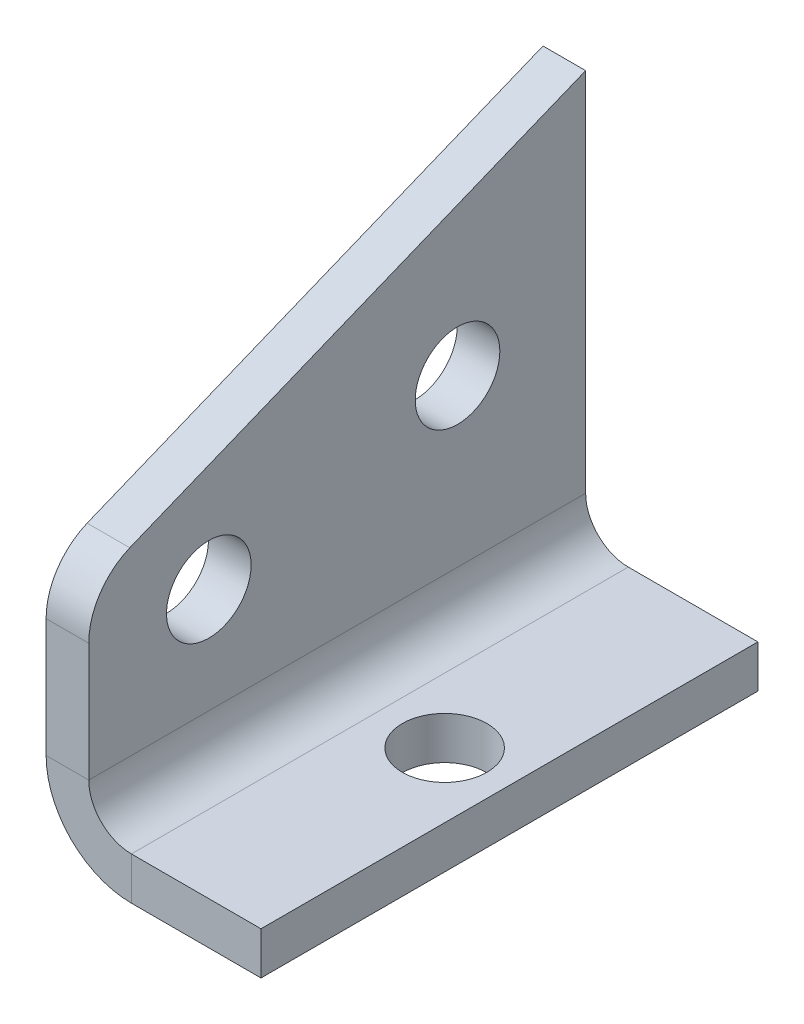
ISO-10303-21;
HEADER;
FILE_DESCRIPTION(('STEP AP214'),'2;1');
FILE_NAME('part.step','',(''),(''),'','','');
FILE_SCHEMA(('AUTOMOTIVE_DESIGN { 1 0 10303 214 1 1 1 1 }'));
ENDSEC;
DATA;
#1=APPLICATION_CONTEXT('core data for automotive mechanical design processes');
#2=APPLICATION_PROTOCOL_DEFINITION('international standard','automotive_design',2000,#1);
#3=PRODUCT_CONTEXT('',#1,'mechanical');
#4=PRODUCT('Part','Part','',(#3));
#5=PRODUCT_RELATED_PRODUCT_CATEGORY('part','',(#4));
#6=PRODUCT_DEFINITION_FORMATION('','',#4);
#7=PRODUCT_DEFINITION_CONTEXT('part definition',#1,'design');
#8=PRODUCT_DEFINITION('design','',#6,#7);
#9=PRODUCT_DEFINITION_SHAPE('','',#8);
#10=(LENGTH_UNIT() NAMED_UNIT(*) SI_UNIT(.MILLI.,.METRE.));
#11=(NAMED_UNIT(*) PLANE_ANGLE_UNIT() SI_UNIT($,.RADIAN.));
#12=(NAMED_UNIT(*) SI_UNIT($,.STERADIAN.) SOLID_ANGLE_UNIT());
#13=UNCERTAINTY_MEASURE_WITH_UNIT(LENGTH_MEASURE(1.E-05),#10,'distance_accuracy_value','');
#14=(GEOMETRIC_REPRESENTATION_CONTEXT(3) GLOBAL_UNCERTAINTY_ASSIGNED_CONTEXT((#13)) GLOBAL_UNIT_ASSIGNED_CONTEXT((#10,
#11,#12)) REPRESENTATION_CONTEXT('',''));
#15=CARTESIAN_POINT('',(0.,0.,0.));
#16=DIRECTION('',(0.,0.,1.));
#17=DIRECTION('',(1.,0.,0.));
#18=AXIS2_PLACEMENT_3D('',#15,#16,#17);
#19=CARTESIAN_POINT('',(-3.175,40.2912185861881,-48.5510647852261));
#20=DIRECTION('',(0.,0.,-1.));
#21=DIRECTION('',(-1.,0.,0.));
#22=AXIS2_PLACEMENT_3D('',#19,#20,#21);
#23=PLANE('',#22);
#24=DIRECTION('',(0.,1.,0.));
#25=VECTOR('',#24,1.);
#26=CARTESIAN_POINT('',(0.,40.2912185861881,-48.5510647852261));
#27=LINE('',#26,#25);
#28=CARTESIAN_POINT('',(0.,44.8412185861881,-48.5510647852261));
#29=VERTEX_POINT('',#28);
#30=CARTESIAN_POINT('',(0.,72.0930667513475,-48.5510647852261));
#31=VERTEX_POINT('',#30);
#32=EDGE_CURVE('E229',#29,#31,#27,.T.);
#33=ORIENTED_EDGE('',*,*,#32,.F.);
#34=DIRECTION('',(-1.,0.,0.));
#35=VECTOR('',#34,1.);
#36=CARTESIAN_POINT('',(0.,44.8412185861881,-48.5510647852261));
#37=LINE('',#36,#35);
#38=CARTESIAN_POINT('',(-3.175,44.8412185861881,-48.5510647852261));
#39=VERTEX_POINT('',#38);
#40=EDGE_CURVE('E192',#29,#39,#37,.T.);
#41=ORIENTED_EDGE('',*,*,#40,.T.);
#42=DIRECTION('',(0.,1.,0.));
#43=VECTOR('',#42,1.);
#44=CARTESIAN_POINT('',(-3.175,40.2912185861881,-48.5510647852261));
#45=LINE('',#44,#43);
#46=CARTESIAN_POINT('',(-3.175,72.0930667513475,-48.5510647852261));
#47=VERTEX_POINT('',#46);
#48=EDGE_CURVE('E108',#39,#47,#45,.T.);
#49=ORIENTED_EDGE('',*,*,#48,.T.);
#50=DIRECTION('',(1.,0.,0.));
#51=VECTOR('',#50,1.);
#52=CARTESIAN_POINT('',(-3.175,72.0930667513475,-48.5510647852261));
#53=LINE('',#52,#51);
#54=EDGE_CURVE('E67',#47,#31,#53,.T.);
#55=ORIENTED_EDGE('',*,*,#54,.T.);
#56=EDGE_LOOP('',(#33,#41,#49,#55));
#57=FACE_BOUND('',#56,.T.);
#58=ADVANCED_FACE('F63',(#57),#23,.T.);
#59=CARTESIAN_POINT('',(-3.175,53.6927819865224,-16.5509889828002));
#60=DIRECTION('',(1.,0.,0.));
#61=DIRECTION('',(0.,0.,-1.));
#62=AXIS2_PLACEMENT_3D('',#59,#60,#61);
#63=PLANE('',#62);
#64=CARTESIAN_POINT('',(-3.175,57.1947735785803,-39.0112205884761));
#65=DIRECTION('',(1.,0.,0.));
#66=DIRECTION('',(0.,0.,-1.));
#67=AXIS2_PLACEMENT_3D('',#64,#65,#66);
#68=CIRCLE('',#67,3.15);
#69=CARTESIAN_POINT('',(-3.175,57.1947735785803,-42.1612205884761));
#70=VERTEX_POINT('',#69);
#71=EDGE_CURVE('E213',#70,#70,#68,.T.);
#72=ORIENTED_EDGE('',*,*,#71,.T.);
#73=EDGE_LOOP('',(#72));
#74=FACE_BOUND('',#73,.T.);
#75=CARTESIAN_POINT('',(-3.175,52.6725231012808,-20.4902032658352));
#76=DIRECTION('',(1.,0.,0.));
#77=DIRECTION('',(0.,0.,-1.));
#78=AXIS2_PLACEMENT_3D('',#75,#76,#77);
#79=CIRCLE('',#78,3.15);
#80=CARTESIAN_POINT('',(-3.175,52.6725231012808,-23.6402032658352));
#81=VERTEX_POINT('',#80);
#82=EDGE_CURVE('E207',#81,#81,#79,.T.);
#83=ORIENTED_EDGE('',*,*,#82,.T.);
#84=EDGE_LOOP('',(#83));
#85=FACE_BOUND('',#84,.T.);
#86=DIRECTION('',(0.,0.,-1.));
#87=VECTOR('',#86,1.);
#88=CARTESIAN_POINT('',(-3.175,44.8412185861881,-48.5510647852261));
#89=LINE('',#88,#87);
#90=CARTESIAN_POINT('',(-3.175,44.8412185861881,-11.5510647852261));
#91=VERTEX_POINT('',#90);
#92=EDGE_CURVE('E186',#39,#91,#89,.F.);
#93=ORIENTED_EDGE('',*,*,#92,.T.);
#94=DIRECTION('',(0.,-1.,0.));
#95=VECTOR('',#94,1.);
#96=CARTESIAN_POINT('',(-3.175,53.6652498505171,-11.5510647852261));
#97=LINE('',#96,#95);
#98=CARTESIAN_POINT('',(-3.175,53.6652498505171,-11.5510647852261));
#99=VERTEX_POINT('',#98);
#100=EDGE_CURVE('E219',#99,#91,#97,.T.);
#101=ORIENTED_EDGE('',*,*,#100,.F.);
#102=CARTESIAN_POINT('',(-3.175,53.6927819865224,-16.5509889828002));
#103=DIRECTION('',(1.,0.,0.));
#104=DIRECTION('',(0.,0.,-1.));
#105=AXIS2_PLACEMENT_3D('',#102,#103,#104);
#106=CIRCLE('',#105,5.);
#107=CARTESIAN_POINT('',(-3.175,58.2975596939057,-14.6026506483251));
#108=VERTEX_POINT('',#107);
#109=EDGE_CURVE('E226',#108,#99,#106,.T.);
#110=ORIENTED_EDGE('',*,*,#109,.F.);
#111=DIRECTION('',(0.,-0.376469891536026,0.926428853591496));
#112=VECTOR('',#111,1.);
#113=CARTESIAN_POINT('',(-3.175,72.0930667513475,-48.5510647852261));
#114=LINE('',#113,#112);
#115=EDGE_CURVE('E223',#47,#108,#114,.T.);
#116=ORIENTED_EDGE('',*,*,#115,.F.);
#117=ORIENTED_EDGE('',*,*,#48,.F.);
#118=EDGE_LOOP('',(#93,#101,#110,#116,#117));
#119=FACE_BOUND('',#118,.T.);
#120=ADVANCED_FACE('F244',(#74,#85,#119),#63,.F.);
#121=CARTESIAN_POINT('',(0.,53.6927819865224,-16.5509889828002));
#122=DIRECTION('',(1.,0.,0.));
#123=DIRECTION('',(0.,0.,-1.));
#124=AXIS2_PLACEMENT_3D('',#121,#122,#123);
#125=PLANE('',#124);
#126=CARTESIAN_POINT('',(0.,52.6725231012808,-20.4902032658352));
#127=DIRECTION('',(1.,0.,0.));
#128=DIRECTION('',(0.,0.,-1.));
#129=AXIS2_PLACEMENT_3D('',#126,#127,#128);
#130=CIRCLE('',#129,3.15);
#131=CARTESIAN_POINT('',(0.,52.6725231012808,-23.6402032658352));
#132=VERTEX_POINT('',#131);
#133=EDGE_CURVE('E205',#132,#132,#130,.T.);
#134=ORIENTED_EDGE('',*,*,#133,.F.);
#135=EDGE_LOOP('',(#134));
#136=FACE_BOUND('',#135,.T.);
#137=CARTESIAN_POINT('',(0.,57.1947735785803,-39.0112205884761));
#138=DIRECTION('',(1.,0.,0.));
#139=DIRECTION('',(0.,0.,-1.));
#140=AXIS2_PLACEMENT_3D('',#137,#138,#139);
#141=CIRCLE('',#140,3.15);
#142=CARTESIAN_POINT('',(0.,57.1947735785803,-42.1612205884761));
#143=VERTEX_POINT('',#142);
#144=EDGE_CURVE('E210',#143,#143,#141,.T.);
#145=ORIENTED_EDGE('',*,*,#144,.F.);
#146=EDGE_LOOP('',(#145));
#147=FACE_BOUND('',#146,.T.);
#148=DIRECTION('',(0.,-1.,0.));
#149=VECTOR('',#148,1.);
#150=CARTESIAN_POINT('',(0.,53.6652498505171,-11.5510647852261));
#151=LINE('',#150,#149);
#152=CARTESIAN_POINT('',(0.,53.6652498505171,-11.5510647852261));
#153=VERTEX_POINT('',#152);
#154=CARTESIAN_POINT('',(0.,44.8412185861881,-11.5510647852261));
#155=VERTEX_POINT('',#154);
#156=EDGE_CURVE('E216',#153,#155,#151,.T.);
#157=ORIENTED_EDGE('',*,*,#156,.T.);
#158=DIRECTION('',(0.,0.,-1.));
#159=VECTOR('',#158,1.);
#160=CARTESIAN_POINT('',(0.,44.8412185861881,-48.5510647852261));
#161=LINE('',#160,#159);
#162=EDGE_CURVE('E80',#29,#155,#161,.F.);
#163=ORIENTED_EDGE('',*,*,#162,.F.);
#164=ORIENTED_EDGE('',*,*,#32,.T.);
#165=DIRECTION('',(0.,-0.376469891536026,0.926428853591496));
#166=VECTOR('',#165,1.);
#167=CARTESIAN_POINT('',(0.,72.0930667513475,-48.5510647852261));
#168=LINE('',#167,#166);
#169=CARTESIAN_POINT('',(0.,58.2975596939057,-14.6026506483251));
#170=VERTEX_POINT('',#169);
#171=EDGE_CURVE('E231',#31,#170,#168,.T.);
#172=ORIENTED_EDGE('',*,*,#171,.T.);
#173=CARTESIAN_POINT('',(0.,53.6927819865224,-16.5509889828002));
#174=DIRECTION('',(1.,0.,0.));
#175=DIRECTION('',(0.,0.,-1.));
#176=AXIS2_PLACEMENT_3D('',#173,#174,#175);
#177=CIRCLE('',#176,5.);
#178=EDGE_CURVE('E221',#170,#153,#177,.T.);
#179=ORIENTED_EDGE('',*,*,#178,.T.);
#180=EDGE_LOOP('',(#157,#163,#164,#172,#179));
#181=FACE_BOUND('',#180,.T.);
#182=ADVANCED_FACE('F240',(#136,#147,#181),#125,.T.);
#183=CARTESIAN_POINT('',(-3.175,53.6652498505171,-11.5510647852261));
#184=DIRECTION('',(0.,0.,1.));
#185=DIRECTION('',(0.,-1.,0.));
#186=AXIS2_PLACEMENT_3D('',#183,#184,#185);
#187=PLANE('',#186);
#188=DIRECTION('',(-1.,0.,0.));
#189=VECTOR('',#188,1.);
#190=CARTESIAN_POINT('',(0.,44.8412185861881,-11.5510647852261));
#191=LINE('',#190,#189);
#192=EDGE_CURVE('E202',#155,#91,#191,.T.);
#193=ORIENTED_EDGE('',*,*,#192,.F.);
#194=ORIENTED_EDGE('',*,*,#156,.F.);
#195=DIRECTION('',(1.,0.,0.));
#196=VECTOR('',#195,1.);
#197=CARTESIAN_POINT('',(-3.175,53.6652498505171,-11.5510647852261));
#198=LINE('',#197,#196);
#199=EDGE_CURVE('E13',#99,#153,#198,.T.);
#200=ORIENTED_EDGE('',*,*,#199,.F.);
#201=ORIENTED_EDGE('',*,*,#100,.T.);
#202=EDGE_LOOP('',(#193,#194,#200,#201));
#203=FACE_BOUND('',#202,.T.);
#204=ADVANCED_FACE('F65',(#203),#187,.T.);
#205=CARTESIAN_POINT('',(-3.175,53.6927819865224,-16.5509889828002));
#206=DIRECTION('',(1.,0.,0.));
#207=DIRECTION('',(0.,0.,-1.));
#208=AXIS2_PLACEMENT_3D('',#205,#206,#207);
#209=CYLINDRICAL_SURFACE('',#208,5.);
#210=ORIENTED_EDGE('',*,*,#178,.F.);
#211=DIRECTION('',(1.,0.,0.));
#212=VECTOR('',#211,1.);
#213=CARTESIAN_POINT('',(-3.175,58.2975596939057,-14.6026506483251));
#214=LINE('',#213,#212);
#215=EDGE_CURVE('E72',#108,#170,#214,.T.);
#216=ORIENTED_EDGE('',*,*,#215,.F.);
#217=ORIENTED_EDGE('',*,*,#109,.T.);
#218=ORIENTED_EDGE('',*,*,#199,.T.);
#219=EDGE_LOOP('',(#210,#216,#217,#218));
#220=FACE_BOUND('',#219,.T.);
#221=ADVANCED_FACE('F241',(#220),#209,.T.);
#222=CARTESIAN_POINT('',(-3.175,72.0930667513475,-48.5510647852261));
#223=DIRECTION('',(0.,0.926428853591496,0.376469891536026));
#224=DIRECTION('',(0.,-0.376469891536026,0.926428853591496));
#225=AXIS2_PLACEMENT_3D('',#222,#223,#224);
#226=PLANE('',#225);
#227=ORIENTED_EDGE('',*,*,#171,.F.);
#228=ORIENTED_EDGE('',*,*,#54,.F.);
#229=ORIENTED_EDGE('',*,*,#115,.T.);
#230=ORIENTED_EDGE('',*,*,#215,.T.);
#231=EDGE_LOOP('',(#227,#228,#229,#230));
#232=FACE_BOUND('',#231,.T.);
#233=ADVANCED_FACE('F239',(#232),#226,.T.);
#234=CARTESIAN_POINT('',(-3.175,57.1947735785803,-39.0112205884761));
#235=DIRECTION('',(1.,0.,0.));
#236=DIRECTION('',(0.,0.,-1.));
#237=AXIS2_PLACEMENT_3D('',#234,#235,#236);
#238=CYLINDRICAL_SURFACE('',#237,3.15);
#239=ORIENTED_EDGE('',*,*,#71,.F.);
#240=EDGE_LOOP('',(#239));
#241=FACE_BOUND('',#240,.T.);
#242=ORIENTED_EDGE('',*,*,#144,.T.);
#243=EDGE_LOOP('',(#242));
#244=FACE_BOUND('',#243,.T.);
#245=ADVANCED_FACE('F297',(#241,#244),#238,.F.);
#246=CARTESIAN_POINT('',(-3.175,52.6725231012808,-20.4902032658352));
#247=DIRECTION('',(1.,0.,0.));
#248=DIRECTION('',(0.,0.,-1.));
#249=AXIS2_PLACEMENT_3D('',#246,#247,#248);
#250=CYLINDRICAL_SURFACE('',#249,3.15);
#251=ORIENTED_EDGE('',*,*,#82,.F.);
#252=EDGE_LOOP('',(#251));
#253=FACE_BOUND('',#252,.T.);
#254=ORIENTED_EDGE('',*,*,#133,.T.);
#255=EDGE_LOOP('',(#254));
#256=FACE_BOUND('',#255,.T.);
#257=ADVANCED_FACE('F284',(#253,#256),#250,.F.);
#258=CARTESIAN_POINT('',(3.175,44.8412185861881,-11.5510647852261));
#259=DIRECTION('',(0.,0.,1.));
#260=DIRECTION('',(1.,0.,0.));
#261=AXIS2_PLACEMENT_3D('',#258,#259,#260);
#262=PLANE('',#261);
#263=DIRECTION('',(0.,1.,0.));
#264=VECTOR('',#263,1.);
#265=CARTESIAN_POINT('',(3.17499999999998,38.4912185861881,-11.5510647852261));
#266=LINE('',#265,#264);
#267=CARTESIAN_POINT('',(3.17499999999999,41.6662185861881,-11.5510647852261));
#268=VERTEX_POINT('',#267);
#269=CARTESIAN_POINT('',(3.17499999999998,38.4912185861881,-11.5510647852261));
#270=VERTEX_POINT('',#269);
#271=EDGE_CURVE('E168',#268,#270,#266,.F.);
#272=ORIENTED_EDGE('',*,*,#271,.F.);
#273=CARTESIAN_POINT('',(3.175,44.8412185861881,-11.5510647852261));
#274=DIRECTION('',(0.,0.,-1.));
#275=DIRECTION('',(-1.,0.,0.));
#276=AXIS2_PLACEMENT_3D('',#273,#274,#275);
#277=CIRCLE('',#276,3.175);
#278=EDGE_CURVE('E195',#155,#268,#277,.F.);
#279=ORIENTED_EDGE('',*,*,#278,.F.);
#280=ORIENTED_EDGE('',*,*,#192,.T.);
#281=CARTESIAN_POINT('',(3.175,44.8412185861881,-11.5510647852261));
#282=DIRECTION('',(0.,0.,-1.));
#283=DIRECTION('',(-1.,0.,0.));
#284=AXIS2_PLACEMENT_3D('',#281,#282,#283);
#285=CIRCLE('',#284,6.35);
#286=EDGE_CURVE('E188',#91,#270,#285,.F.);
#287=ORIENTED_EDGE('',*,*,#286,.T.);
#288=EDGE_LOOP('',(#272,#279,#280,#287));
#289=FACE_BOUND('',#288,.T.);
#290=ADVANCED_FACE('F249',(#289),#262,.T.);
#291=CARTESIAN_POINT('',(3.175,44.8412185861881,-48.5510647852261));
#292=DIRECTION('',(0.,0.,1.));
#293=DIRECTION('',(1.,0.,0.));
#294=AXIS2_PLACEMENT_3D('',#291,#292,#293);
#295=PLANE('',#294);
#296=CARTESIAN_POINT('',(3.175,44.8412185861881,-48.5510647852261));
#297=DIRECTION('',(0.,0.,-1.));
#298=DIRECTION('',(-1.,0.,0.));
#299=AXIS2_PLACEMENT_3D('',#296,#297,#298);
#300=CIRCLE('',#299,3.175);
#301=CARTESIAN_POINT('',(3.17499999999999,41.6662185861881,-48.5510647852261));
#302=VERTEX_POINT('',#301);
#303=EDGE_CURVE('E199',#302,#29,#300,.T.);
#304=ORIENTED_EDGE('',*,*,#303,.F.);
#305=DIRECTION('',(0.,1.,0.));
#306=VECTOR('',#305,1.);
#307=CARTESIAN_POINT('',(3.17499999999999,41.6662185861881,-48.5510647852261));
#308=LINE('',#307,#306);
#309=CARTESIAN_POINT('',(3.17499999999998,38.4912185861881,-48.5510647852261));
#310=VERTEX_POINT('',#309);
#311=EDGE_CURVE('E179',#302,#310,#308,.F.);
#312=ORIENTED_EDGE('',*,*,#311,.T.);
#313=CARTESIAN_POINT('',(3.175,44.8412185861881,-48.5510647852261));
#314=DIRECTION('',(0.,0.,-1.));
#315=DIRECTION('',(-1.,0.,0.));
#316=AXIS2_PLACEMENT_3D('',#313,#314,#315);
#317=CIRCLE('',#316,6.35);
#318=EDGE_CURVE('E189',#310,#39,#317,.T.);
#319=ORIENTED_EDGE('',*,*,#318,.T.);
#320=ORIENTED_EDGE('',*,*,#40,.F.);
#321=EDGE_LOOP('',(#304,#312,#319,#320));
#322=FACE_BOUND('',#321,.T.);
#323=ADVANCED_FACE('F276',(#322),#295,.F.);
#324=CARTESIAN_POINT('',(3.175,44.8412185861881,-48.5510647852261));
#325=DIRECTION('',(0.,0.,-1.));
#326=DIRECTION('',(0.,-1.,0.));
#327=AXIS2_PLACEMENT_3D('',#324,#325,#326);
#328=CYLINDRICAL_SURFACE('',#327,6.35);
#329=ORIENTED_EDGE('',*,*,#92,.F.);
#330=ORIENTED_EDGE('',*,*,#318,.F.);
#331=DIRECTION('',(0.,0.,-1.));
#332=VECTOR('',#331,1.);
#333=CARTESIAN_POINT('',(3.17499999999998,38.4912185861881,-11.5510647852261));
#334=LINE('',#333,#332);
#335=EDGE_CURVE('E177',#310,#270,#334,.F.);
#336=ORIENTED_EDGE('',*,*,#335,.T.);
#337=ORIENTED_EDGE('',*,*,#286,.F.);
#338=EDGE_LOOP('',(#329,#330,#336,#337));
#339=FACE_BOUND('',#338,.T.);
#340=ADVANCED_FACE('F251',(#339),#328,.T.);
#341=CARTESIAN_POINT('',(3.175,44.8412185861881,-48.5510647852261));
#342=DIRECTION('',(0.,0.,-1.));
#343=DIRECTION('',(0.,-1.,0.));
#344=AXIS2_PLACEMENT_3D('',#341,#342,#343);
#345=CYLINDRICAL_SURFACE('',#344,3.175);
#346=ORIENTED_EDGE('',*,*,#162,.T.);
#347=ORIENTED_EDGE('',*,*,#278,.T.);
#348=DIRECTION('',(0.,0.,-1.));
#349=VECTOR('',#348,1.);
#350=CARTESIAN_POINT('',(3.17499999999999,41.6662185861881,-11.5510647852261));
#351=LINE('',#350,#349);
#352=EDGE_CURVE('E182',#268,#302,#351,.T.);
#353=ORIENTED_EDGE('',*,*,#352,.T.);
#354=ORIENTED_EDGE('',*,*,#303,.T.);
#355=EDGE_LOOP('',(#346,#347,#353,#354));
#356=FACE_BOUND('',#355,.T.);
#357=ADVANCED_FACE('F274',(#356),#345,.F.);
#358=CARTESIAN_POINT('',(0.,38.4912185861881,-11.5510647852261));
#359=DIRECTION('',(0.,0.,-1.));
#360=DIRECTION('',(-1.,0.,0.));
#361=AXIS2_PLACEMENT_3D('',#358,#359,#360);
#362=PLANE('',#361);
#363=ORIENTED_EDGE('',*,*,#271,.T.);
#364=DIRECTION('',(-1.,0.,0.));
#365=VECTOR('',#364,1.);
#366=CARTESIAN_POINT('',(1.19710565943884E-13,38.4912185861881,-11.5510647852261));
#367=LINE('',#366,#365);
#368=CARTESIAN_POINT('',(12.825,38.491218586188,-11.5510647852261));
#369=VERTEX_POINT('',#368);
#370=EDGE_CURVE('E149',#369,#270,#367,.T.);
#371=ORIENTED_EDGE('',*,*,#370,.F.);
#372=DIRECTION('',(0.,1.,0.));
#373=VECTOR('',#372,1.);
#374=CARTESIAN_POINT('',(12.825,38.491218586188,-11.5510647852261));
#375=LINE('',#374,#373);
#376=CARTESIAN_POINT('',(12.825,41.666218586188,-11.5510647852261));
#377=VERTEX_POINT('',#376);
#378=EDGE_CURVE('E155',#369,#377,#375,.T.);
#379=ORIENTED_EDGE('',*,*,#378,.T.);
#380=DIRECTION('',(1.,0.,0.));
#381=VECTOR('',#380,1.);
#382=CARTESIAN_POINT('',(0.,41.6662185861881,-11.5510647852261));
#383=LINE('',#382,#381);
#384=EDGE_CURVE('E175',#377,#268,#383,.F.);
#385=ORIENTED_EDGE('',*,*,#384,.T.);
#386=EDGE_LOOP('',(#363,#371,#379,#385));
#387=FACE_BOUND('',#386,.T.);
#388=ADVANCED_FACE('F167',(#387),#362,.F.);
#389=CARTESIAN_POINT('',(12.825,38.491218586188,-48.5510647852261));
#390=DIRECTION('',(0.,0.,1.));
#391=DIRECTION('',(1.,0.,0.));
#392=AXIS2_PLACEMENT_3D('',#389,#390,#391);
#393=PLANE('',#392);
#394=ORIENTED_EDGE('',*,*,#311,.F.);
#395=DIRECTION('',(-1.,0.,0.));
#396=VECTOR('',#395,1.);
#397=CARTESIAN_POINT('',(12.825,41.666218586188,-48.5510647852261));
#398=LINE('',#397,#396);
#399=CARTESIAN_POINT('',(12.825,41.666218586188,-48.5510647852261));
#400=VERTEX_POINT('',#399);
#401=EDGE_CURVE('E171',#302,#400,#398,.F.);
#402=ORIENTED_EDGE('',*,*,#401,.T.);
#403=DIRECTION('',(0.,1.,0.));
#404=VECTOR('',#403,1.);
#405=CARTESIAN_POINT('',(12.825,38.491218586188,-48.5510647852261));
#406=LINE('',#405,#404);
#407=CARTESIAN_POINT('',(12.825,38.491218586188,-48.5510647852261));
#408=VERTEX_POINT('',#407);
#409=EDGE_CURVE('E164',#408,#400,#406,.T.);
#410=ORIENTED_EDGE('',*,*,#409,.F.);
#411=DIRECTION('',(1.,0.,0.));
#412=VECTOR('',#411,1.);
#413=CARTESIAN_POINT('',(1.19710565943884E-13,38.4912185861881,-48.5510647852261));
#414=LINE('',#413,#412);
#415=EDGE_CURVE('E151',#310,#408,#414,.T.);
#416=ORIENTED_EDGE('',*,*,#415,.F.);
#417=EDGE_LOOP('',(#394,#402,#410,#416));
#418=FACE_BOUND('',#417,.T.);
#419=ADVANCED_FACE('F254',(#418),#393,.F.);
#420=CARTESIAN_POINT('',(1.19710565943884E-13,38.4912185861881,0.));
#421=DIRECTION('',(0.,1.,0.));
#422=DIRECTION('',(-1.,0.,0.));
#423=AXIS2_PLACEMENT_3D('',#420,#421,#422);
#424=PLANE('',#423);
#425=CARTESIAN_POINT('',(7.99999999999998,38.491218586188,-30.0510647852261));
#426=DIRECTION('',(0.,1.,0.));
#427=DIRECTION('',(-1.,0.,0.));
#428=AXIS2_PLACEMENT_3D('',#425,#426,#427);
#429=CIRCLE('',#428,3.15);
#430=CARTESIAN_POINT('',(4.84999999999998,38.491218586188,-30.0510647852261));
#431=VERTEX_POINT('',#430);
#432=EDGE_CURVE('E185',#431,#431,#429,.T.);
#433=ORIENTED_EDGE('',*,*,#432,.T.);
#434=EDGE_LOOP('',(#433));
#435=FACE_BOUND('',#434,.T.);
#436=ORIENTED_EDGE('',*,*,#335,.F.);
#437=ORIENTED_EDGE('',*,*,#415,.T.);
#438=DIRECTION('',(0.,0.,1.));
#439=VECTOR('',#438,1.);
#440=CARTESIAN_POINT('',(12.825,38.491218586188,0.));
#441=LINE('',#440,#439);
#442=EDGE_CURVE('E144',#408,#369,#441,.T.);
#443=ORIENTED_EDGE('',*,*,#442,.T.);
#444=ORIENTED_EDGE('',*,*,#370,.T.);
#445=EDGE_LOOP('',(#436,#437,#443,#444));
#446=FACE_BOUND('',#445,.T.);
#447=ADVANCED_FACE('F147',(#435,#446),#424,.F.);
#448=CARTESIAN_POINT('',(1.30796019194711E-13,41.6662185861881,0.));
#449=DIRECTION('',(0.,1.,0.));
#450=DIRECTION('',(-1.,0.,0.));
#451=AXIS2_PLACEMENT_3D('',#448,#449,#450);
#452=PLANE('',#451);
#453=CARTESIAN_POINT('',(7.99999999999999,41.666218586188,-30.0510647852261));
#454=DIRECTION('',(0.,1.,0.));
#455=DIRECTION('',(-1.,0.,0.));
#456=AXIS2_PLACEMENT_3D('',#453,#454,#455);
#457=CIRCLE('',#456,3.15);
#458=CARTESIAN_POINT('',(4.84999999999999,41.666218586188,-30.0510647852261));
#459=VERTEX_POINT('',#458);
#460=EDGE_CURVE('E260',#459,#459,#457,.T.);
#461=ORIENTED_EDGE('',*,*,#460,.F.);
#462=EDGE_LOOP('',(#461));
#463=FACE_BOUND('',#462,.T.);
#464=ORIENTED_EDGE('',*,*,#401,.F.);
#465=ORIENTED_EDGE('',*,*,#352,.F.);
#466=ORIENTED_EDGE('',*,*,#384,.F.);
#467=DIRECTION('',(0.,0.,-1.));
#468=VECTOR('',#467,1.);
#469=CARTESIAN_POINT('',(12.825,41.666218586188,-11.5510647852261));
#470=LINE('',#469,#468);
#471=EDGE_CURVE('E160',#400,#377,#470,.F.);
#472=ORIENTED_EDGE('',*,*,#471,.F.);
#473=EDGE_LOOP('',(#464,#465,#466,#472));
#474=FACE_BOUND('',#473,.T.);
#475=ADVANCED_FACE('F267',(#463,#474),#452,.T.);
#476=CARTESIAN_POINT('',(12.825,38.491218586188,-11.5510647852261));
#477=DIRECTION('',(-1.,0.,0.));
#478=DIRECTION('',(0.,-1.,0.));
#479=AXIS2_PLACEMENT_3D('',#476,#477,#478);
#480=PLANE('',#479);
#481=ORIENTED_EDGE('',*,*,#471,.T.);
#482=ORIENTED_EDGE('',*,*,#378,.F.);
#483=ORIENTED_EDGE('',*,*,#442,.F.);
#484=ORIENTED_EDGE('',*,*,#409,.T.);
#485=EDGE_LOOP('',(#481,#482,#483,#484));
#486=FACE_BOUND('',#485,.T.);
#487=ADVANCED_FACE('F158',(#486),#480,.F.);
#488=CARTESIAN_POINT('',(7.99999999999995,31.666218586188,-30.0510647852261));
#489=DIRECTION('',(0.,1.,0.));
#490=DIRECTION('',(-1.,0.,0.));
#491=AXIS2_PLACEMENT_3D('',#488,#489,#490);
#492=CYLINDRICAL_SURFACE('',#491,3.15);
#493=ORIENTED_EDGE('',*,*,#460,.T.);
#494=EDGE_LOOP('',(#493));
#495=FACE_BOUND('',#494,.T.);
#496=ORIENTED_EDGE('',*,*,#432,.F.);
#497=EDGE_LOOP('',(#496));
#498=FACE_BOUND('',#497,.T.);
#499=ADVANCED_FACE('F264',(#495,#498),#492,.F.);
#500=CLOSED_SHELL('',(#58,#120,#182,#204,#221,#233,#245,#257,#290,#323,#340,#357,#388,#419,#447,
#475,#487,#499));
#501=MANIFOLD_SOLID_BREP('B2',#500);
#502=ADVANCED_BREP_SHAPE_REPRESENTATION('',(#18,#501),#14);
#503=SHAPE_DEFINITION_REPRESENTATION(#9,#502);
ENDSEC;
END-ISO-10303-21;
